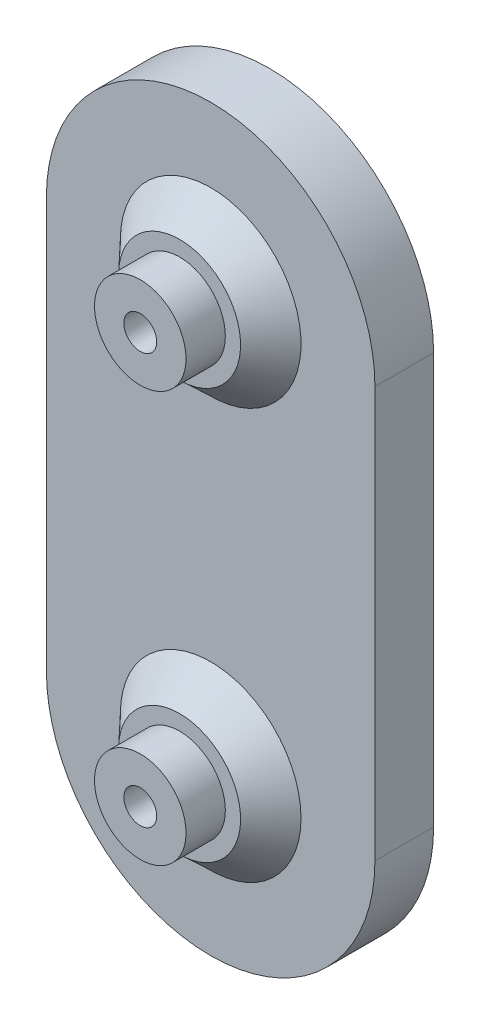
ISO-10303-21;
HEADER;
FILE_DESCRIPTION(('STEP AP214'),'2;1');
FILE_NAME('part.step','',(''),(''),'','','');
FILE_SCHEMA(('AUTOMOTIVE_DESIGN { 1 0 10303 214 1 1 1 1 }'));
ENDSEC;
DATA;
#1=APPLICATION_CONTEXT('core data for automotive mechanical design processes');
#2=APPLICATION_PROTOCOL_DEFINITION('international standard','automotive_design',2000,#1);
#3=PRODUCT_CONTEXT('',#1,'mechanical');
#4=PRODUCT('Part','Part','',(#3));
#5=PRODUCT_RELATED_PRODUCT_CATEGORY('part','',(#4));
#6=PRODUCT_DEFINITION_FORMATION('','',#4);
#7=PRODUCT_DEFINITION_CONTEXT('part definition',#1,'design');
#8=PRODUCT_DEFINITION('design','',#6,#7);
#9=PRODUCT_DEFINITION_SHAPE('','',#8);
#10=(LENGTH_UNIT() NAMED_UNIT(*) SI_UNIT(.MILLI.,.METRE.));
#11=(NAMED_UNIT(*) PLANE_ANGLE_UNIT() SI_UNIT($,.RADIAN.));
#12=(NAMED_UNIT(*) SI_UNIT($,.STERADIAN.) SOLID_ANGLE_UNIT());
#13=UNCERTAINTY_MEASURE_WITH_UNIT(LENGTH_MEASURE(1.E-05),#10,'distance_accuracy_value','');
#14=(GEOMETRIC_REPRESENTATION_CONTEXT(3) GLOBAL_UNCERTAINTY_ASSIGNED_CONTEXT((#13)) GLOBAL_UNIT_ASSIGNED_CONTEXT((#10,
#11,#12)) REPRESENTATION_CONTEXT('',''));
#15=CARTESIAN_POINT('',(0.,0.,0.));
#16=DIRECTION('',(0.,0.,1.));
#17=DIRECTION('',(1.,0.,0.));
#18=AXIS2_PLACEMENT_3D('',#15,#16,#17);
#19=CARTESIAN_POINT('',(0.,0.,-3.35));
#20=DIRECTION('',(0.,0.,1.));
#21=DIRECTION('',(1.,0.,0.));
#22=AXIS2_PLACEMENT_3D('',#19,#20,#21);
#23=CYLINDRICAL_SURFACE('',#22,3.9);
#24=CARTESIAN_POINT('',(0.,0.,-3.35));
#25=DIRECTION('',(0.,0.,1.));
#26=DIRECTION('',(1.,0.,0.));
#27=AXIS2_PLACEMENT_3D('',#24,#25,#26);
#28=CIRCLE('',#27,3.9);
#29=CARTESIAN_POINT('',(3.9,0.,-3.35));
#30=VERTEX_POINT('',#29);
#31=EDGE_CURVE('E172',#30,#30,#28,.T.);
#32=ORIENTED_EDGE('',*,*,#31,.T.);
#33=EDGE_LOOP('',(#32));
#34=FACE_BOUND('',#33,.T.);
#35=CARTESIAN_POINT('',(0.,0.,0.));
#36=DIRECTION('',(0.,0.,1.));
#37=DIRECTION('',(1.,0.,0.));
#38=AXIS2_PLACEMENT_3D('',#35,#36,#37);
#39=CIRCLE('',#38,3.9);
#40=CARTESIAN_POINT('',(3.9,0.,0.));
#41=VERTEX_POINT('',#40);
#42=EDGE_CURVE('E59',#41,#41,#39,.T.);
#43=ORIENTED_EDGE('',*,*,#42,.F.);
#44=EDGE_LOOP('',(#43));
#45=FACE_BOUND('',#44,.T.);
#46=ADVANCED_FACE('F51',(#34,#45),#23,.T.);
#47=CARTESIAN_POINT('',(0.,0.,0.));
#48=DIRECTION('',(0.,0.,1.));
#49=DIRECTION('',(1.,0.,0.));
#50=AXIS2_PLACEMENT_3D('',#47,#48,#49);
#51=PLANE('',#50);
#52=CARTESIAN_POINT('',(0.,0.,0.));
#53=DIRECTION('',(0.,0.,1.));
#54=DIRECTION('',(1.,0.,0.));
#55=AXIS2_PLACEMENT_3D('',#52,#53,#54);
#56=CIRCLE('',#55,1.4);
#57=CARTESIAN_POINT('',(1.4,0.,0.));
#58=VERTEX_POINT('',#57);
#59=EDGE_CURVE('E171',#58,#58,#56,.T.);
#60=ORIENTED_EDGE('',*,*,#59,.F.);
#61=EDGE_LOOP('',(#60));
#62=FACE_BOUND('',#61,.T.);
#63=ORIENTED_EDGE('',*,*,#42,.T.);
#64=EDGE_LOOP('',(#63));
#65=FACE_BOUND('',#64,.T.);
#66=ADVANCED_FACE('F198',(#62,#65),#51,.T.);
#67=CARTESIAN_POINT('',(0.,0.,-3.35));
#68=DIRECTION('',(0.,0.,1.));
#69=DIRECTION('',(1.,0.,0.));
#70=AXIS2_PLACEMENT_3D('',#67,#68,#69);
#71=CYLINDRICAL_SURFACE('',#70,1.4);
#72=ORIENTED_EDGE('',*,*,#59,.T.);
#73=EDGE_LOOP('',(#72));
#74=FACE_BOUND('',#73,.T.);
#75=CARTESIAN_POINT('',(0.,0.,-11.));
#76=DIRECTION('',(0.,0.,1.));
#77=DIRECTION('',(1.,0.,0.));
#78=AXIS2_PLACEMENT_3D('',#75,#76,#77);
#79=CIRCLE('',#78,1.4);
#80=CARTESIAN_POINT('',(1.4,0.,-11.));
#81=VERTEX_POINT('',#80);
#82=EDGE_CURVE('E214',#81,#81,#79,.T.);
#83=ORIENTED_EDGE('',*,*,#82,.F.);
#84=EDGE_LOOP('',(#83));
#85=FACE_BOUND('',#84,.T.);
#86=ADVANCED_FACE('F194',(#74,#85),#71,.F.);
#87=CARTESIAN_POINT('',(0.,0.,-3.35));
#88=DIRECTION('',(0.,0.,-1.));
#89=DIRECTION('',(-1.,0.,0.));
#90=AXIS2_PLACEMENT_3D('',#87,#88,#89);
#91=CONICAL_SURFACE('',#90,5.2,0.75628018189041);
#92=CARTESIAN_POINT('',(0.,0.,-3.35));
#93=DIRECTION('',(0.,0.,-1.));
#94=DIRECTION('',(-1.,0.,0.));
#95=AXIS2_PLACEMENT_3D('',#92,#93,#94);
#96=CIRCLE('',#95,5.2);
#97=CARTESIAN_POINT('',(-5.2,0.,-3.35));
#98=VERTEX_POINT('',#97);
#99=EDGE_CURVE('E130',#98,#98,#96,.T.);
#100=ORIENTED_EDGE('',*,*,#99,.T.);
#101=EDGE_LOOP('',(#100));
#102=FACE_BOUND('',#101,.T.);
#103=CARTESIAN_POINT('',(0.,0.,-6.));
#104=DIRECTION('',(0.,0.,-1.));
#105=DIRECTION('',(-1.,0.,0.));
#106=AXIS2_PLACEMENT_3D('',#103,#104,#105);
#107=CIRCLE('',#106,7.7);
#108=CARTESIAN_POINT('',(-7.7,0.,-6.));
#109=VERTEX_POINT('',#108);
#110=EDGE_CURVE('E135',#109,#109,#107,.T.);
#111=ORIENTED_EDGE('',*,*,#110,.F.);
#112=EDGE_LOOP('',(#111));
#113=FACE_BOUND('',#112,.T.);
#114=ADVANCED_FACE('F184',(#102,#113),#91,.T.);
#115=CARTESIAN_POINT('',(0.,0.,-3.35));
#116=DIRECTION('',(0.,0.,-1.));
#117=DIRECTION('',(-1.,0.,0.));
#118=AXIS2_PLACEMENT_3D('',#115,#116,#117);
#119=PLANE('',#118);
#120=ORIENTED_EDGE('',*,*,#31,.F.);
#121=EDGE_LOOP('',(#120));
#122=FACE_BOUND('',#121,.T.);
#123=ORIENTED_EDGE('',*,*,#99,.F.);
#124=EDGE_LOOP('',(#123));
#125=FACE_BOUND('',#124,.T.);
#126=ADVANCED_FACE('F152',(#122,#125),#119,.F.);
#127=CARTESIAN_POINT('',(0.,0.,-6.));
#128=DIRECTION('',(0.,0.,-1.));
#129=DIRECTION('',(-1.,0.,0.));
#130=AXIS2_PLACEMENT_3D('',#127,#128,#129);
#131=PLANE('',#130);
#132=CARTESIAN_POINT('',(0.,-35.,-6.));
#133=DIRECTION('',(0.,0.,1.));
#134=DIRECTION('',(1.,0.,0.));
#135=AXIS2_PLACEMENT_3D('',#132,#133,#134);
#136=CIRCLE('',#135,7.7);
#137=CARTESIAN_POINT('',(7.7,-35.,-6.));
#138=VERTEX_POINT('',#137);
#139=EDGE_CURVE('E120',#138,#138,#136,.T.);
#140=ORIENTED_EDGE('',*,*,#139,.F.);
#141=EDGE_LOOP('',(#140));
#142=FACE_BOUND('',#141,.T.);
#143=DIRECTION('',(0.,1.,0.));
#144=VECTOR('',#143,1.);
#145=CARTESIAN_POINT('',(-14.,-35.,-6.));
#146=LINE('',#145,#144);
#147=CARTESIAN_POINT('',(-13.9999999999997,-35.,-6.));
#148=VERTEX_POINT('',#147);
#149=CARTESIAN_POINT('',(-13.9999999999997,0.,-6.));
#150=VERTEX_POINT('',#149);
#151=EDGE_CURVE('E118',#148,#150,#146,.T.);
#152=ORIENTED_EDGE('',*,*,#151,.F.);
#153=CARTESIAN_POINT('',(0.,-35.,-6.));
#154=DIRECTION('',(0.,0.,1.));
#155=DIRECTION('',(1.,0.,0.));
#156=AXIS2_PLACEMENT_3D('',#153,#154,#155);
#157=CIRCLE('',#156,13.9999999999997);
#158=CARTESIAN_POINT('',(13.9999999999993,-35.,-6.));
#159=VERTEX_POINT('',#158);
#160=EDGE_CURVE('E124',#148,#159,#157,.T.);
#161=ORIENTED_EDGE('',*,*,#160,.T.);
#162=DIRECTION('',(0.,-1.,0.));
#163=VECTOR('',#162,1.);
#164=CARTESIAN_POINT('',(13.9999999999993,0.,-6.));
#165=LINE('',#164,#163);
#166=CARTESIAN_POINT('',(13.9999999999997,0.,-6.));
#167=VERTEX_POINT('',#166);
#168=EDGE_CURVE('E122',#167,#159,#165,.T.);
#169=ORIENTED_EDGE('',*,*,#168,.F.);
#170=CARTESIAN_POINT('',(0.,0.,-6.));
#171=DIRECTION('',(0.,0.,-1.));
#172=DIRECTION('',(-1.,0.,0.));
#173=AXIS2_PLACEMENT_3D('',#170,#171,#172);
#174=CIRCLE('',#173,13.9999999999997);
#175=EDGE_CURVE('E107',#150,#167,#174,.T.);
#176=ORIENTED_EDGE('',*,*,#175,.F.);
#177=EDGE_LOOP('',(#152,#161,#169,#176));
#178=FACE_BOUND('',#177,.T.);
#179=ORIENTED_EDGE('',*,*,#110,.T.);
#180=EDGE_LOOP('',(#179));
#181=FACE_BOUND('',#180,.T.);
#182=ADVANCED_FACE('F141',(#142,#178,#181),#131,.F.);
#183=CARTESIAN_POINT('',(-14.,-35.,-11.));
#184=DIRECTION('',(1.,0.,0.));
#185=DIRECTION('',(0.,0.,-1.));
#186=AXIS2_PLACEMENT_3D('',#183,#184,#185);
#187=PLANE('',#186);
#188=ORIENTED_EDGE('',*,*,#151,.T.);
#189=DIRECTION('',(0.,0.,1.));
#190=VECTOR('',#189,1.);
#191=CARTESIAN_POINT('',(-13.9999999999997,0.,-11.));
#192=LINE('',#191,#190);
#193=CARTESIAN_POINT('',(-13.9999999999997,0.,-11.));
#194=VERTEX_POINT('',#193);
#195=EDGE_CURVE('E110',#194,#150,#192,.T.);
#196=ORIENTED_EDGE('',*,*,#195,.F.);
#197=DIRECTION('',(0.,1.,0.));
#198=VECTOR('',#197,1.);
#199=CARTESIAN_POINT('',(-14.,-35.,-11.));
#200=LINE('',#199,#198);
#201=CARTESIAN_POINT('',(-13.9999999999997,-35.,-11.));
#202=VERTEX_POINT('',#201);
#203=EDGE_CURVE('E101',#202,#194,#200,.T.);
#204=ORIENTED_EDGE('',*,*,#203,.F.);
#205=DIRECTION('',(0.,0.,1.));
#206=VECTOR('',#205,1.);
#207=CARTESIAN_POINT('',(-13.9999999999997,-35.,-11.));
#208=LINE('',#207,#206);
#209=EDGE_CURVE('E67',#202,#148,#208,.T.);
#210=ORIENTED_EDGE('',*,*,#209,.T.);
#211=EDGE_LOOP('',(#188,#196,#204,#210));
#212=FACE_BOUND('',#211,.T.);
#213=ADVANCED_FACE('F151',(#212),#187,.F.);
#214=CARTESIAN_POINT('',(0.,0.,-11.));
#215=DIRECTION('',(0.,0.,1.));
#216=DIRECTION('',(1.,0.,0.));
#217=AXIS2_PLACEMENT_3D('',#214,#215,#216);
#218=CYLINDRICAL_SURFACE('',#217,13.9999999999997);
#219=ORIENTED_EDGE('',*,*,#175,.T.);
#220=DIRECTION('',(0.,0.,1.));
#221=VECTOR('',#220,1.);
#222=CARTESIAN_POINT('',(13.9999999999997,0.,-11.));
#223=LINE('',#222,#221);
#224=CARTESIAN_POINT('',(13.9999999999997,0.,-11.));
#225=VERTEX_POINT('',#224);
#226=EDGE_CURVE('E105',#225,#167,#223,.T.);
#227=ORIENTED_EDGE('',*,*,#226,.F.);
#228=CARTESIAN_POINT('',(0.,0.,-11.));
#229=DIRECTION('',(0.,0.,-1.));
#230=DIRECTION('',(-1.,0.,0.));
#231=AXIS2_PLACEMENT_3D('',#228,#229,#230);
#232=CIRCLE('',#231,13.9999999999997);
#233=EDGE_CURVE('E94',#194,#225,#232,.T.);
#234=ORIENTED_EDGE('',*,*,#233,.F.);
#235=ORIENTED_EDGE('',*,*,#195,.T.);
#236=EDGE_LOOP('',(#219,#227,#234,#235));
#237=FACE_BOUND('',#236,.T.);
#238=ADVANCED_FACE('F106',(#237),#218,.T.);
#239=CARTESIAN_POINT('',(13.9999999999993,0.,-11.));
#240=DIRECTION('',(-1.,0.,0.));
#241=DIRECTION('',(0.,0.,1.));
#242=AXIS2_PLACEMENT_3D('',#239,#240,#241);
#243=PLANE('',#242);
#244=ORIENTED_EDGE('',*,*,#168,.T.);
#245=DIRECTION('',(0.,0.,1.));
#246=VECTOR('',#245,1.);
#247=CARTESIAN_POINT('',(13.9999999999993,-35.,-11.));
#248=LINE('',#247,#246);
#249=CARTESIAN_POINT('',(13.9999999999993,-35.,-11.));
#250=VERTEX_POINT('',#249);
#251=EDGE_CURVE('E82',#250,#159,#248,.T.);
#252=ORIENTED_EDGE('',*,*,#251,.F.);
#253=DIRECTION('',(0.,-1.,0.));
#254=VECTOR('',#253,1.);
#255=CARTESIAN_POINT('',(13.9999999999993,0.,-11.));
#256=LINE('',#255,#254);
#257=EDGE_CURVE('E100',#225,#250,#256,.T.);
#258=ORIENTED_EDGE('',*,*,#257,.F.);
#259=ORIENTED_EDGE('',*,*,#226,.T.);
#260=EDGE_LOOP('',(#244,#252,#258,#259));
#261=FACE_BOUND('',#260,.T.);
#262=ADVANCED_FACE('F112',(#261),#243,.F.);
#263=CARTESIAN_POINT('',(0.,-35.,-11.));
#264=DIRECTION('',(0.,0.,1.));
#265=DIRECTION('',(1.,0.,0.));
#266=AXIS2_PLACEMENT_3D('',#263,#264,#265);
#267=CYLINDRICAL_SURFACE('',#266,13.9999999999997);
#268=ORIENTED_EDGE('',*,*,#160,.F.);
#269=ORIENTED_EDGE('',*,*,#209,.F.);
#270=CARTESIAN_POINT('',(0.,-35.,-11.));
#271=DIRECTION('',(0.,0.,1.));
#272=DIRECTION('',(1.,0.,0.));
#273=AXIS2_PLACEMENT_3D('',#270,#271,#272);
#274=CIRCLE('',#273,13.9999999999997);
#275=EDGE_CURVE('E113',#202,#250,#274,.T.);
#276=ORIENTED_EDGE('',*,*,#275,.T.);
#277=ORIENTED_EDGE('',*,*,#251,.T.);
#278=EDGE_LOOP('',(#268,#269,#276,#277));
#279=FACE_BOUND('',#278,.T.);
#280=ADVANCED_FACE('F155',(#279),#267,.T.);
#281=CARTESIAN_POINT('',(0.,0.,-11.));
#282=DIRECTION('',(0.,0.,-1.));
#283=DIRECTION('',(-1.,0.,0.));
#284=AXIS2_PLACEMENT_3D('',#281,#282,#283);
#285=PLANE('',#284);
#286=CARTESIAN_POINT('',(0.,-35.,-11.));
#287=DIRECTION('',(0.,0.,-1.));
#288=DIRECTION('',(1.,0.,0.));
#289=AXIS2_PLACEMENT_3D('',#286,#287,#288);
#290=CIRCLE('',#289,1.4);
#291=CARTESIAN_POINT('',(1.4,-35.,-11.));
#292=VERTEX_POINT('',#291);
#293=EDGE_CURVE('E217',#292,#292,#290,.T.);
#294=ORIENTED_EDGE('',*,*,#293,.F.);
#295=EDGE_LOOP('',(#294));
#296=FACE_BOUND('',#295,.T.);
#297=ORIENTED_EDGE('',*,*,#82,.T.);
#298=EDGE_LOOP('',(#297));
#299=FACE_BOUND('',#298,.T.);
#300=ORIENTED_EDGE('',*,*,#203,.T.);
#301=ORIENTED_EDGE('',*,*,#233,.T.);
#302=ORIENTED_EDGE('',*,*,#257,.T.);
#303=ORIENTED_EDGE('',*,*,#275,.F.);
#304=EDGE_LOOP('',(#300,#301,#302,#303));
#305=FACE_BOUND('',#304,.T.);
#306=ADVANCED_FACE('F97',(#296,#299,#305),#285,.T.);
#307=CARTESIAN_POINT('',(0.,-35.,-3.35));
#308=DIRECTION('',(0.,0.,-1.));
#309=DIRECTION('',(-1.,0.,0.));
#310=AXIS2_PLACEMENT_3D('',#307,#308,#309);
#311=PLANE('',#310);
#312=CARTESIAN_POINT('',(0.,-35.,-3.35));
#313=DIRECTION('',(0.,0.,-1.));
#314=DIRECTION('',(-1.,0.,0.));
#315=AXIS2_PLACEMENT_3D('',#312,#313,#314);
#316=CIRCLE('',#315,3.9);
#317=CARTESIAN_POINT('',(-3.9,-35.,-3.35));
#318=VERTEX_POINT('',#317);
#319=EDGE_CURVE('E12',#318,#318,#316,.F.);
#320=ORIENTED_EDGE('',*,*,#319,.F.);
#321=EDGE_LOOP('',(#320));
#322=FACE_BOUND('',#321,.T.);
#323=CARTESIAN_POINT('',(-5.2,-35.,-3.35));
#324=CARTESIAN_POINT('',(-5.20000295050321,-35.0850850664871,-3.35));
#325=CARTESIAN_POINT('',(-5.19791234187158,-35.1701697101025,-3.35));
#326=CARTESIAN_POINT('',(-5.18956040266221,-35.3401341029027,-3.35));
#327=CARTESIAN_POINT('',(-5.18329907208446,-35.4250138520876,-3.35));
#328=CARTESIAN_POINT('',(-5.16661308974257,-35.5944557550004,-3.35));
#329=CARTESIAN_POINT('',(-5.15618395387595,-35.6790174673227,-3.35));
#330=CARTESIAN_POINT('',(-5.13120530314879,-35.8473437405288,-3.35));
#331=CARTESIAN_POINT('',(-5.11666471427762,-35.9311096263739,-3.35));
#332=CARTESIAN_POINT('',(-5.08346639957724,-36.0980097140642,-3.35));
#333=CARTESIAN_POINT('',(-5.06479985179413,-36.1811421614431,-3.35));
#334=CARTESIAN_POINT('',(-5.02344325274284,-36.3462096763021,-3.35));
#335=CARTESIAN_POINT('',(-5.00076195697947,-36.4281469376919,-3.35));
#336=CARTESIAN_POINT('',(-4.95136426226274,-36.5909893212404,-3.35));
#337=CARTESIAN_POINT('',(-4.92463925643661,-36.6718918327931,-3.35));
#338=CARTESIAN_POINT('',(-4.86730240036357,-36.8321108551043,-3.35));
#339=CARTESIAN_POINT('',(-4.83669904859036,-36.9114304074284,-3.35));
#340=CARTESIAN_POINT('',(-4.77157786033453,-37.0686468374096,-3.35));
#341=CARTESIAN_POINT('',(-4.73705171435317,-37.1465402734186,-3.35));
#342=CARTESIAN_POINT('',(-4.66428674378138,-37.3003678032679,-3.35));
#343=CARTESIAN_POINT('',(-4.6260560786288,-37.3763057570262,-3.35));
#344=CARTESIAN_POINT('',(-4.54583856093963,-37.5263821541194,-3.35));
#345=CARTESIAN_POINT('',(-4.50384377626059,-37.6005163579062,-3.35));
#346=CARTESIAN_POINT('',(-4.41635145456511,-37.7464709518647,-3.35));
#347=CARTESIAN_POINT('',(-4.37086165935936,-37.8182959831329,-3.35));
#348=CARTESIAN_POINT('',(-4.27632035160665,-37.9597870296545,-3.35));
#349=CARTESIAN_POINT('',(-4.22726136066127,-38.0294480482884,-3.35));
#350=CARTESIAN_POINT('',(-4.12588428650786,-38.1661240838132,-3.35));
#351=CARTESIAN_POINT('',(-4.07357345292467,-38.2331444782825,-3.35));
#352=CARTESIAN_POINT('',(-3.96561883964288,-38.3646875381118,-3.35));
#353=CARTESIAN_POINT('',(-3.90996810731076,-38.4292044979011,-3.35));
#354=CARTESIAN_POINT('',(-3.79568259732606,-38.5552857100542,-3.35));
#355=CARTESIAN_POINT('',(-3.73705450729453,-38.6168560246895,-3.35));
#356=CARTESIAN_POINT('',(-3.616726250428,-38.7371842662517,-3.35));
#357=CARTESIAN_POINT('',(-3.55501972368203,-38.7959358336046,-3.35));
#358=CARTESIAN_POINT('',(-3.42892640980089,-38.9102079913899,-3.35));
#359=CARTESIAN_POINT('',(-3.3645456838775,-38.9657352704037,-3.35));
#360=CARTESIAN_POINT('',(-3.23300261031787,-39.073689866955,-3.35));
#361=CARTESIAN_POINT('',(-3.16583455674266,-39.1261102321613,-3.35));
#362=CARTESIAN_POINT('',(-3.02914778650727,-39.2274728322319,-3.35));
#363=CARTESIAN_POINT('',(-2.95963444627686,-39.2764223175728,-3.35));
#364=CARTESIAN_POINT('',(-2.81814338773126,-39.3709636073343,-3.35));
#365=CARTESIAN_POINT('',(-2.74616067240038,-39.4165479336212,-3.35));
#366=CARTESIAN_POINT('',(-2.60019681412869,-39.5040247987278,-3.35));
#367=CARTESIAN_POINT('',(-2.52622031105768,-39.5459250800934,-3.35));
#368=CARTESIAN_POINT('',(-2.37614390376678,-39.6261425787633,-3.35));
#369=CARTESIAN_POINT('',(-2.30003975957848,-39.6644518641498,-3.35));
#370=CARTESIAN_POINT('',(-2.14620452501759,-39.7372005442618,-3.35));
#371=CARTESIAN_POINT('',(-2.06847729327036,-39.7716480990375,-3.35));
#372=CARTESIAN_POINT('',(-1.91126085507628,-39.836769268252,-3.35));
#373=CARTESIAN_POINT('',(-1.83176820654148,-39.8674345733781,-3.35));
#374=CARTESIAN_POINT('',(-1.67154311309511,-39.9247544589375,-3.35));
#375=CARTESIAN_POINT('',(-1.59081370840379,-39.9514175383397,-3.35));
#376=CARTESIAN_POINT('',(-1.42797131955034,-40.0008152256403,-3.35));
#377=CARTESIAN_POINT('',(-1.34585572432993,-40.0235412268539,-3.35));
#378=CARTESIAN_POINT('',(-1.18078382723593,-40.0648802960285,-3.35));
#379=CARTESIAN_POINT('',(-1.09782971789847,-40.0835021200273,-3.35));
#380=CARTESIAN_POINT('',(-0.930929639608958,-40.1167005986819,-3.35));
#381=CARTESIAN_POINT('',(-0.846981915774232,-40.1312684321679,-3.35));
#382=CARTESIAN_POINT('',(-0.678652947639092,-40.1562285671235,-3.35));
#383=CARTESIAN_POINT('',(-0.594273027075373,-40.1666297973741,-3.35));
#384=CARTESIAN_POINT('',(-0.424922598340132,-40.1833093478852,-3.35));
#385=CARTESIAN_POINT('',(-0.33995120836201,-40.1895787174438,-3.35));
#386=CARTESIAN_POINT('',(-0.169986269166846,-40.197919538436,-3.35));
#387=CARTESIAN_POINT('',(-0.0849931621387553,-40.200000005405,-3.35));
#388=CARTESIAN_POINT('',(0.0851766798376291,-40.1999999945833,-3.35));
#389=CARTESIAN_POINT('',(0.170353415024171,-40.1979105227584,-3.35));
#390=CARTESIAN_POINT('',(0.340317470002625,-40.1895517031215,-3.35));
#391=CARTESIAN_POINT('',(0.425105233411845,-40.1832913707749,-3.35));
#392=CARTESIAN_POINT('',(0.59445566002612,-40.1666117987243,-3.35));
#393=CARTESIAN_POINT('',(0.679017441898769,-40.1561836082717,-3.35));
#394=CARTESIAN_POINT('',(0.847343765899261,-40.1312056480082,-3.35));
#395=CARTESIAN_POINT('',(0.931109633178402,-40.1166648067687,-3.35));
#396=CARTESIAN_POINT('',(1.0980097072457,-40.0834663068863,-3.35));
#397=CARTESIAN_POINT('',(1.1811421596185,-40.0647998269807,-3.35));
#398=CARTESIAN_POINT('',(1.34620967812438,-40.0234432775024,-3.35));
#399=CARTESIAN_POINT('',(1.42814693818081,-40.0007619636199,-3.35));
#400=CARTESIAN_POINT('',(1.59098932075133,-39.9513642556077,-3.35));
#401=CARTESIAN_POINT('',(1.67189183266311,-39.9246392546548,-3.35));
#402=CARTESIAN_POINT('',(1.83211085523609,-39.8673024021408,-3.35));
#403=CARTESIAN_POINT('',(1.911430407464,-39.8366990490669,-3.35));
#404=CARTESIAN_POINT('',(2.06864683737476,-39.7715778598566,-3.35));
#405=CARTESIAN_POINT('',(2.14654027340987,-39.737051714225,-3.35));
#406=CARTESIAN_POINT('',(2.30036780327793,-39.6642867439087,-3.35));
#407=CARTESIAN_POINT('',(2.37630575702903,-39.6260560786629,-3.35));
#408=CARTESIAN_POINT('',(2.526382154117,-39.5458385609053,-3.35));
#409=CARTESIAN_POINT('',(2.60051635790567,-39.5038437762513,-3.35));
#410=CARTESIAN_POINT('',(2.74647095186551,-39.4163514545741,-3.35));
#411=CARTESIAN_POINT('',(2.81829598313313,-39.3708616593618,-3.35));
#412=CARTESIAN_POINT('',(2.95978702965429,-39.2763203516042,-3.35));
#413=CARTESIAN_POINT('',(3.02944804828831,-39.2272613606606,-3.35));
#414=CARTESIAN_POINT('',(3.1661240838132,-39.1258842865086,-3.35));
#415=CARTESIAN_POINT('',(3.23314447828252,-39.0735734529249,-3.35));
#416=CARTESIAN_POINT('',(3.36468753811179,-38.9656188396427,-3.35));
#417=CARTESIAN_POINT('',(3.42920449790107,-38.9099681073108,-3.35));
#418=CARTESIAN_POINT('',(3.55528571005418,-38.7956825973261,-3.35));
#419=CARTESIAN_POINT('',(3.61685602468944,-38.7370545072946,-3.35));
#420=CARTESIAN_POINT('',(3.73718426625205,-38.6167262504276,-3.35));
#421=CARTESIAN_POINT('',(3.79593583360536,-38.5550197236813,-3.35));
#422=CARTESIAN_POINT('',(3.91020799139065,-38.4289264098002,-3.35));
#423=CARTESIAN_POINT('',(3.96573527040407,-38.3645456838771,-3.35));
#424=CARTESIAN_POINT('',(4.07368986695539,-38.2330026103174,-3.35));
#425=CARTESIAN_POINT('',(4.12611023216203,-38.1658345567417,-3.35));
#426=CARTESIAN_POINT('',(4.22747283223252,-38.0291477865063,-3.35));
#427=CARTESIAN_POINT('',(4.27642231757312,-37.9596344462764,-3.35));
#428=CARTESIAN_POINT('',(4.37096360733432,-37.8181433877312,-3.35));
#429=CARTESIAN_POINT('',(4.41654793362126,-37.7461606724002,-3.35));
#430=CARTESIAN_POINT('',(4.50402479872787,-37.6001968141285,-3.35));
#431=CARTESIAN_POINT('',(4.54592508009347,-37.5262203110576,-3.35));
#432=CARTESIAN_POINT('',(4.62614257876325,-37.3761439037668,-3.35));
#433=CARTESIAN_POINT('',(4.66445186414984,-37.3000397595785,-3.35));
#434=CARTESIAN_POINT('',(4.73720054426184,-37.1462045250176,-3.35));
#435=CARTESIAN_POINT('',(4.77164809903749,-37.0684772932704,-3.35));
#436=CARTESIAN_POINT('',(4.83676926825189,-36.9112608550766,-3.35));
#437=CARTESIAN_POINT('',(4.86743457337783,-36.831768206542,-3.35));
#438=CARTESIAN_POINT('',(4.92475445893725,-36.6715431130957,-3.35));
#439=CARTESIAN_POINT('',(4.95141753833954,-36.5908137084041,-3.35));
#440=CARTESIAN_POINT('',(5.00081522564033,-36.4279713195503,-3.35));
#441=CARTESIAN_POINT('',(5.02354122685397,-36.3458557243299,-3.35));
#442=CARTESIAN_POINT('',(5.06488029602863,-36.1807838272359,-3.35));
#443=CARTESIAN_POINT('',(5.08350212002733,-36.0978297178984,-3.35));
#444=CARTESIAN_POINT('',(5.11670059868191,-35.9309296396086,-3.35));
#445=CARTESIAN_POINT('',(5.13126843216801,-35.8469819157736,-3.35));
#446=CARTESIAN_POINT('',(5.15622856712355,-35.6786529476384,-3.35));
#447=CARTESIAN_POINT('',(5.16662979737408,-35.5942730270751,-3.35));
#448=CARTESIAN_POINT('',(5.18330934788521,-35.4249225983401,-3.35));
#449=CARTESIAN_POINT('',(5.18957871744379,-35.339951208362,-3.35));
#450=CARTESIAN_POINT('',(5.19791953843601,-35.1699862691669,-3.35));
#451=CARTESIAN_POINT('',(5.20000000540505,-35.0849931621388,-3.35));
#452=CARTESIAN_POINT('',(5.19999999458328,-34.9148233201624,-3.35));
#453=CARTESIAN_POINT('',(5.1979105227584,-34.8296465849758,-3.35));
#454=CARTESIAN_POINT('',(5.18955170312154,-34.6596825299974,-3.35));
#455=CARTESIAN_POINT('',(5.18329137077485,-34.5748947665882,-3.35));
#456=CARTESIAN_POINT('',(5.16661179872428,-34.4055443399739,-3.35));
#457=CARTESIAN_POINT('',(5.15618360827166,-34.3209825581012,-3.35));
#458=CARTESIAN_POINT('',(5.13120564800823,-34.1526562341007,-3.35));
#459=CARTESIAN_POINT('',(5.11666480676868,-34.0688903668216,-3.35));
#460=CARTESIAN_POINT('',(5.08346630688632,-33.9019902927543,-3.35));
#461=CARTESIAN_POINT('',(5.06479982698074,-33.8188578403815,-3.35));
#462=CARTESIAN_POINT('',(5.02344327750243,-33.6537903218756,-3.35));
#463=CARTESIAN_POINT('',(5.00076196361992,-33.5718530618192,-3.35));
#464=CARTESIAN_POINT('',(4.95136425560767,-33.4090106792487,-3.35));
#465=CARTESIAN_POINT('',(4.92463925465475,-33.3281081673369,-3.35));
#466=CARTESIAN_POINT('',(4.86730240214084,-33.1678891447639,-3.35));
#467=CARTESIAN_POINT('',(4.83669904906693,-33.088569592536,-3.35));
#468=CARTESIAN_POINT('',(4.77157785985659,-32.9313531626252,-3.35));
#469=CARTESIAN_POINT('',(4.73705171422495,-32.8534597265901,-3.35));
#470=CARTESIAN_POINT('',(4.66428674390868,-32.6996321967221,-3.35));
#471=CARTESIAN_POINT('',(4.62605607866287,-32.623694242971,-3.35));
#472=CARTESIAN_POINT('',(4.5458385609054,-32.4736178458833,-3.35));
#473=CARTESIAN_POINT('',(4.50384377625152,-32.3994836420949,-3.35));
#474=CARTESIAN_POINT('',(4.4163514545744,-32.253529048135,-3.35));
#475=CARTESIAN_POINT('',(4.37086165936189,-32.1817040168671,-3.35));
#476=CARTESIAN_POINT('',(4.27632035160445,-32.040212970346,-3.35));
#477=CARTESIAN_POINT('',(4.22726136066113,-31.9705519517123,-3.35));
#478=CARTESIAN_POINT('',(4.12588428650906,-31.8338759161874,-3.35));
#479=CARTESIAN_POINT('',(4.07357345292511,-31.7668555217178,-3.35));
#480=CARTESIAN_POINT('',(3.96561883964272,-31.6353124618882,-3.35));
#481=CARTESIAN_POINT('',(3.90996810731077,-31.5707955020989,-3.35));
#482=CARTESIAN_POINT('',(3.79568259732616,-31.4447142899458,-3.35));
#483=CARTESIAN_POINT('',(3.73705450729456,-31.3831439753105,-3.35));
#484=CARTESIAN_POINT('',(3.61672625042762,-31.262815733748,-3.35));
#485=CARTESIAN_POINT('',(3.55501972368132,-31.2040641663947,-3.35));
#486=CARTESIAN_POINT('',(3.42892640980015,-31.0897920086094,-3.35));
#487=CARTESIAN_POINT('',(3.36454568387712,-31.0342647295959,-3.35));
#488=CARTESIAN_POINT('',(3.23300261031756,-30.9263101330448,-3.35));
#489=CARTESIAN_POINT('',(3.16583455674202,-30.8738897678383,-3.35));
#490=CARTESIAN_POINT('',(3.02914778650661,-30.7725271677677,-3.35));
#491=CARTESIAN_POINT('',(2.95963444627653,-30.723577682427,-3.35));
#492=CARTESIAN_POINT('',(2.81814338773118,-30.6290363926657,-3.35));
#493=CARTESIAN_POINT('',(2.74616067240021,-30.5834520663787,-3.35));
#494=CARTESIAN_POINT('',(2.60019681412851,-30.4959752012721,-3.35));
#495=CARTESIAN_POINT('',(2.52622031105759,-30.4540749199065,-3.35));
#496=CARTESIAN_POINT('',(2.37614390376679,-30.3738574212368,-3.35));
#497=CARTESIAN_POINT('',(2.30003975957848,-30.3355481358502,-3.35));
#498=CARTESIAN_POINT('',(2.1462045250176,-30.2627994557382,-3.35));
#499=CARTESIAN_POINT('',(2.06847729327037,-30.2283519009625,-3.35));
#500=CARTESIAN_POINT('',(1.91126085507655,-30.1632307317481,-3.35));
#501=CARTESIAN_POINT('',(1.83176820654201,-30.1325654266221,-3.35));
#502=CARTESIAN_POINT('',(1.67154311309565,-30.0752455410627,-3.35));
#503=CARTESIAN_POINT('',(1.59081370840406,-30.0485824616604,-3.35));
#504=CARTESIAN_POINT('',(1.42797131955071,-29.9991847743598,-3.35));
#505=CARTESIAN_POINT('',(1.34585572433067,-29.9764587731463,-3.35));
#506=CARTESIAN_POINT('',(1.18078382723668,-29.9351197039717,-3.35));
#507=CARTESIAN_POINT('',(1.09782971789884,-29.9164978799728,-3.35));
#508=CARTESIAN_POINT('',(0.930929639608806,-29.8832994013181,-3.35));
#509=CARTESIAN_POINT('',(0.846981915773931,-29.8687315678319,-3.35));
#510=CARTESIAN_POINT('',(0.678652947638789,-29.8437714328764,-3.35));
#511=CARTESIAN_POINT('',(0.594273027075218,-29.8333702026259,-3.35));
#512=CARTESIAN_POINT('',(0.424922598339746,-29.8166906521148,-3.35));
#513=CARTESIAN_POINT('',(0.339951208361242,-29.8104212825562,-3.35));
#514=CARTESIAN_POINT('',(0.169986269166078,-29.802080461564,-3.35));
#515=CARTESIAN_POINT('',(0.0849931621383723,-29.799999994595,-3.35));
#516=CARTESIAN_POINT('',(-0.0851766798375847,-29.8000000054167,-3.35));
#517=CARTESIAN_POINT('',(-0.170353415024083,-29.8020894772416,-3.35));
#518=CARTESIAN_POINT('',(-0.340317470002537,-29.8104482968785,-3.35));
#519=CARTESIAN_POINT('',(-0.425105233411801,-29.8167086292252,-3.35));
#520=CARTESIAN_POINT('',(-0.594455660025982,-29.8333882012757,-3.35));
#521=CARTESIAN_POINT('',(-0.679017441898496,-29.8438163917283,-3.35));
#522=CARTESIAN_POINT('',(-0.847343765898992,-29.8687943519917,-3.35));
#523=CARTESIAN_POINT('',(-0.931109633178271,-29.8833351932313,-3.35));
#524=CARTESIAN_POINT('',(-1.09800970724514,-29.9165336931136,-3.35));
#525=CARTESIAN_POINT('',(-1.1811421596174,-29.9352001730191,-3.35));
#526=CARTESIAN_POINT('',(-1.34620967812329,-29.9765567224973,-3.35));
#527=CARTESIAN_POINT('',(-1.42814693818027,-29.9992380363799,-3.35));
#528=CARTESIAN_POINT('',(-1.59098932075064,-30.0486357443921,-3.35));
#529=CARTESIAN_POINT('',(-1.67189183266175,-30.0753607453448,-3.35));
#530=CARTESIAN_POINT('',(-1.83211085523474,-30.1326975978586,-3.35));
#531=CARTESIAN_POINT('',(-1.91143040746333,-30.1633009509328,-3.35));
#532=CARTESIAN_POINT('',(-2.06864683737449,-30.2284221401433,-3.35));
#533=CARTESIAN_POINT('',(-2.14654027340935,-30.2629482857748,-3.35));
#534=CARTESIAN_POINT('',(-2.30036780327744,-30.335713256091,-3.35));
#535=CARTESIAN_POINT('',(-2.37630575702879,-30.373943921337,-3.35));
#536=CARTESIAN_POINT('',(-2.52638215411673,-30.4541614390946,-3.35));
#537=CARTESIAN_POINT('',(-2.60051635790512,-30.4961562237485,-3.35));
#538=CARTESIAN_POINT('',(-2.74647095186498,-30.5836485454256,-3.35));
#539=CARTESIAN_POINT('',(-2.81829598313287,-30.6291383406381,-3.35));
#540=CARTESIAN_POINT('',(-2.95978702965396,-30.7236796483955,-3.35));
#541=CARTESIAN_POINT('',(-3.02944804828765,-30.7727386393389,-3.35));
#542=CARTESIAN_POINT('',(-3.16612408381256,-30.8741157134909,-3.35));
#543=CARTESIAN_POINT('',(-3.2331444782822,-30.9264265470749,-3.35));
#544=CARTESIAN_POINT('',(-3.36468753811168,-31.0343811603572,-3.35));
#545=CARTESIAN_POINT('',(-3.42920449790087,-31.090031892689,-3.35));
#546=CARTESIAN_POINT('',(-3.555285710054,-31.2043174026736,-3.35));
#547=CARTESIAN_POINT('',(-3.61685602468937,-31.2629454927053,-3.35));
#548=CARTESIAN_POINT('',(-3.73718426625194,-31.3832737495723,-3.35));
#549=CARTESIAN_POINT('',(-3.79593583360511,-31.4449802763185,-3.35));
#550=CARTESIAN_POINT('',(-3.91020799139055,-31.5710735901997,-3.35));
#551=CARTESIAN_POINT('',(-3.96573527040426,-31.6354543161228,-3.35));
#552=CARTESIAN_POINT('',(-4.07368986695486,-31.7669973896823,-3.35));
#553=CARTESIAN_POINT('',(-4.12611023216052,-31.8341654432577,-3.35));
#554=CARTESIAN_POINT('',(-4.22747283223299,-31.970852213493,-3.35));
#555=CARTESIAN_POINT('',(-4.27642231757649,-32.0403655537231,-3.35));
#556=CARTESIAN_POINT('',(-4.3709636073306,-32.1818566122689,-3.35));
#557=CARTESIAN_POINT('',(-4.41654793360755,-32.2538393276002,-3.35));
#558=CARTESIAN_POINT('',(-4.50402479874128,-32.3998031858704,-3.35));
#559=CARTESIAN_POINT('',(-4.54592508014389,-32.4737796889394,-3.35));
#560=CARTESIAN_POINT('',(-4.62614257871263,-32.6238560962361,-3.35));
#561=CARTESIAN_POINT('',(-4.66445186396082,-32.6999602404322,-3.35));
#562=CARTESIAN_POINT('',(-4.73720054445037,-32.8537954749717,-3.35));
#563=CARTESIAN_POINT('',(-4.77164809974056,-32.9315227066899,-3.35));
#564=CARTESIAN_POINT('',(-4.8367692675473,-33.0887391449633,-3.35));
#565=CARTESIAN_POINT('',(-4.86743457074576,-33.1682317936069,-3.35));
#566=CARTESIAN_POINT('',(-4.9247544615637,-33.3284568867557,-3.35));
#567=CARTESIAN_POINT('',(-4.95141754813236,-33.4091862910419,-3.35));
#568=CARTESIAN_POINT('',(-5.00081521582623,-33.5720286810044,-3.35));
#569=CARTESIAN_POINT('',(-5.02354119019329,-33.6541442777432,-3.35));
#570=CARTESIAN_POINT('',(-5.06488033260969,-33.8192161706938,-3.35));
#571=CARTESIAN_POINT('',(-5.08350225642329,-33.9021702743849,-3.35));
#572=CARTESIAN_POINT('',(-5.11670046199132,-34.069070368124,-3.35));
#573=CARTESIAN_POINT('',(-5.13126792155483,-34.1530181131124,-3.35));
#574=CARTESIAN_POINT('',(-5.15622907663675,-34.321347023537,-3.35));
#575=CARTESIAN_POINT('',(-5.16663169712879,-34.4057268654519,-3.35));
#576=CARTESIAN_POINT('',(-5.18330294751618,-34.5750318450077,-3.35));
#577=CARTESIAN_POINT('',(-5.1895648558153,-34.6599576444006,-3.35));
#578=CARTESIAN_POINT('',(-5.19791092832568,-34.829922385092,-3.35));
#579=CARTESIAN_POINT('',(-5.1999995931023,-34.9149611054313,-3.35));
#580=CARTESIAN_POINT('',(-5.2,-35.,-3.35));
#581=B_SPLINE_CURVE_WITH_KNOTS('',3,(#323,#324,#325,#326,#327,#328,#329,#330,#331,#332,#333,
#334,#335,#336,#337,#338,#339,#340,#341,#342,#343,#344,#345,#346,#347,#348,#349,#350,#351,#352,
#353,#354,#355,#356,#357,#358,#359,#360,#361,#362,#363,#364,#365,#366,#367,#368,#369,#370,#371,
#372,#373,#374,#375,#376,#377,#378,#379,#380,#381,#382,#383,#384,#385,#386,#387,#388,#389,#390,
#391,#392,#393,#394,#395,#396,#397,#398,#399,#400,#401,#402,#403,#404,#405,#406,#407,#408,#409,
#410,#411,#412,#413,#414,#415,#416,#417,#418,#419,#420,#421,#422,#423,#424,#425,#426,#427,#428,
#429,#430,#431,#432,#433,#434,#435,#436,#437,#438,#439,#440,#441,#442,#443,#444,#445,#446,#447,
#448,#449,#450,#451,#452,#453,#454,#455,#456,#457,#458,#459,#460,#461,#462,#463,#464,#465,#466,
#467,#468,#469,#470,#471,#472,#473,#474,#475,#476,#477,#478,#479,#480,#481,#482,#483,#484,#485,
#486,#487,#488,#489,#490,#491,#492,#493,#494,#495,#496,#497,#498,#499,#500,#501,#502,#503,#504,
#505,#506,#507,#508,#509,#510,#511,#512,#513,#514,#515,#516,#517,#518,#519,#520,#521,#522,#523,
#524,#525,#526,#527,#528,#529,#530,#531,#532,#533,#534,#535,#536,#537,#538,#539,#540,#541,#542,
#543,#544,#545,#546,#547,#548,#549,#550,#551,#552,#553,#554,#555,#556,#557,#558,#559,#560,#561,
#562,#563,#564,#565,#566,#567,#568,#569,#570,#571,#572,#573,#574,#575,#576,#577,#578,#579,#580),
.UNSPECIFIED.,.F.,.F.,(4,2,2,2,2,2,2,2,2,2,2,2,2,2,2,2,2,2,2,2,2,2,2,2,2,2,2,2,2,2,2,2,2,2,2,2,
2,2,2,2,2,2,2,2,2,2,2,2,2,2,2,2,2,2,2,2,2,2,2,2,2,2,2,2,2,2,2,2,2,2,2,2,2,2,2,2,2,2,2,2,2,2,2,2,
2,2,2,2,2,2,2,2,2,2,2,2,2,2,2,2,2,2,2,2,2,2,2,2,2,2,2,2,2,2,2,2,2,2,2,2,2,2,2,2,2,2,2,2,4),(0.,
0.255228776638291,0.510457553276573,0.765961670631859,1.0209152907402,1.27641940809502,
1.53137302820381,1.78687714555802,2.04183076566743,2.29733488302152,2.55228850313105,
2.80779262048557,3.06274624059467,3.31825035794988,3.57320397805829,3.8287080954136,
4.08366171552191,4.33916583287605,4.59411945298553,4.84962357033915,5.10457719044915,
5.36008130780266,5.61503492791276,5.87053904526676,6.12549266537639,6.3809967827319,
6.63595040284001,6.89145452019569,7.14640814030363,7.40191225765838,7.65686587776724,
7.91236999512142,8.16732361523086,8.42282773258625,8.67778135269448,8.93328547005073,
9.1882390901581,9.44374320751415,9.69869682762172,9.95420094497756,10.2091545650853,
10.4646586824405,10.719612302549,10.9751164199038,11.2300700400126,11.4855741573677,
11.7405277774762,11.9960318948314,12.2509855149398,12.5064896322955,12.7614432524034,
13.0169473697589,13.2719009898671,13.5274051072209,13.7823587273307,14.0378628446847,
14.2928164647943,14.5483205821489,14.8032742022579,15.0587783196137,15.3137319397215,
15.5692360570773,15.8241896771851,16.0796937945393,16.3346474146488,16.5901515320042,
16.8451051521124,17.1006092694686,17.355562889576,17.6110670069321,17.8660206270396,
18.1215247443955,18.3764783645032,18.6319824818584,18.8869361019669,19.1424402193209,
19.3973938394305,19.6528979567844,19.9078515768941,20.1633556942494,20.4183093143577,
20.6738134317134,20.9287670518213,21.1842711691761,21.439224789285,21.6947289066388,
21.9496825267486,22.2051866441026,22.4601402642122,22.7156443815669,22.9705980016758,
23.2261021190304,23.4810557391394,23.7365598564947,23.9915134766031,24.2470175939584,
24.5019712140667,24.7574753314219,25.0124289515303,25.2679330688861,25.5228866889939,
25.7783908063483,26.0333444264575,26.2888485438112,26.5438021639212,26.7993062812755,
27.0542599013848,27.3097640187387,27.5647176388484,27.8202217562023,28.075175376312,
28.3306794936668,28.5856331137756,28.841137231131,29.0960908512393,29.3515949685934,
29.6065485887029,29.8620527060561,30.1170063261665,30.3725104435205,30.6274640636301,
30.8829681809847,31.1379218010937,31.3934259184481,31.6483795385574,31.9038836559125,
32.158837276021,32.4142037515933,32.6692946824539),.UNSPECIFIED.);
#582=CARTESIAN_POINT('',(-5.2,-35.,-3.35));
#583=VERTEX_POINT('',#582);
#584=EDGE_CURVE('E227',#583,#583,#581,.T.);
#585=ORIENTED_EDGE('',*,*,#584,.T.);
#586=EDGE_LOOP('',(#585));
#587=FACE_BOUND('',#586,.T.);
#588=ADVANCED_FACE('F246',(#322,#587),#311,.F.);
#589=CARTESIAN_POINT('',(0.,-35.,-3.35));
#590=DIRECTION('',(0.,0.,-1.));
#591=DIRECTION('',(-1.,0.,0.));
#592=AXIS2_PLACEMENT_3D('',#589,#590,#591);
#593=CONICAL_SURFACE('',#592,5.2,0.75628018189041);
#594=ORIENTED_EDGE('',*,*,#584,.F.);
#595=EDGE_LOOP('',(#594));
#596=FACE_BOUND('',#595,.T.);
#597=ORIENTED_EDGE('',*,*,#139,.T.);
#598=EDGE_LOOP('',(#597));
#599=FACE_BOUND('',#598,.T.);
#600=ADVANCED_FACE('F236',(#596,#599),#593,.T.);
#601=CARTESIAN_POINT('',(0.,-35.,0.));
#602=DIRECTION('',(0.,0.,1.));
#603=DIRECTION('',(1.,0.,0.));
#604=AXIS2_PLACEMENT_3D('',#601,#602,#603);
#605=PLANE('',#604);
#606=CARTESIAN_POINT('',(0.,-35.,0.));
#607=DIRECTION('',(0.,0.,-1.));
#608=DIRECTION('',(1.,0.,0.));
#609=AXIS2_PLACEMENT_3D('',#606,#607,#608);
#610=CIRCLE('',#609,3.9);
#611=CARTESIAN_POINT('',(3.9,-35.,0.));
#612=VERTEX_POINT('',#611);
#613=EDGE_CURVE('E220',#612,#612,#610,.T.);
#614=ORIENTED_EDGE('',*,*,#613,.F.);
#615=EDGE_LOOP('',(#614));
#616=FACE_BOUND('',#615,.T.);
#617=CARTESIAN_POINT('',(0.,-35.,0.));
#618=DIRECTION('',(0.,0.,-1.));
#619=DIRECTION('',(1.,0.,0.));
#620=AXIS2_PLACEMENT_3D('',#617,#618,#619);
#621=CIRCLE('',#620,1.4);
#622=CARTESIAN_POINT('',(1.4,-35.,0.));
#623=VERTEX_POINT('',#622);
#624=EDGE_CURVE('E216',#623,#623,#621,.T.);
#625=ORIENTED_EDGE('',*,*,#624,.T.);
#626=EDGE_LOOP('',(#625));
#627=FACE_BOUND('',#626,.T.);
#628=ADVANCED_FACE('F245',(#616,#627),#605,.T.);
#629=CARTESIAN_POINT('',(0.,-35.,-3.35));
#630=DIRECTION('',(0.,0.,1.));
#631=DIRECTION('',(1.,0.,0.));
#632=AXIS2_PLACEMENT_3D('',#629,#630,#631);
#633=CYLINDRICAL_SURFACE('',#632,3.9);
#634=ORIENTED_EDGE('',*,*,#319,.T.);
#635=EDGE_LOOP('',(#634));
#636=FACE_BOUND('',#635,.T.);
#637=ORIENTED_EDGE('',*,*,#613,.T.);
#638=EDGE_LOOP('',(#637));
#639=FACE_BOUND('',#638,.T.);
#640=ADVANCED_FACE('F277',(#636,#639),#633,.T.);
#641=CARTESIAN_POINT('',(0.,-35.,-3.35));
#642=DIRECTION('',(0.,0.,1.));
#643=DIRECTION('',(1.,0.,0.));
#644=AXIS2_PLACEMENT_3D('',#641,#642,#643);
#645=CYLINDRICAL_SURFACE('',#644,1.4);
#646=ORIENTED_EDGE('',*,*,#624,.F.);
#647=EDGE_LOOP('',(#646));
#648=FACE_BOUND('',#647,.T.);
#649=ORIENTED_EDGE('',*,*,#293,.T.);
#650=EDGE_LOOP('',(#649));
#651=FACE_BOUND('',#650,.T.);
#652=ADVANCED_FACE('F280',(#648,#651),#645,.F.);
#653=CLOSED_SHELL('',(#46,#66,#86,#114,#126,#182,#213,#238,#262,#280,#306,#588,#600,#628,#640,#652));
#654=MANIFOLD_SOLID_BREP('B2',#653);
#655=ADVANCED_BREP_SHAPE_REPRESENTATION('',(#18,#654),#14);
#656=SHAPE_DEFINITION_REPRESENTATION(#9,#655);
ENDSEC;
END-ISO-10303-21;
